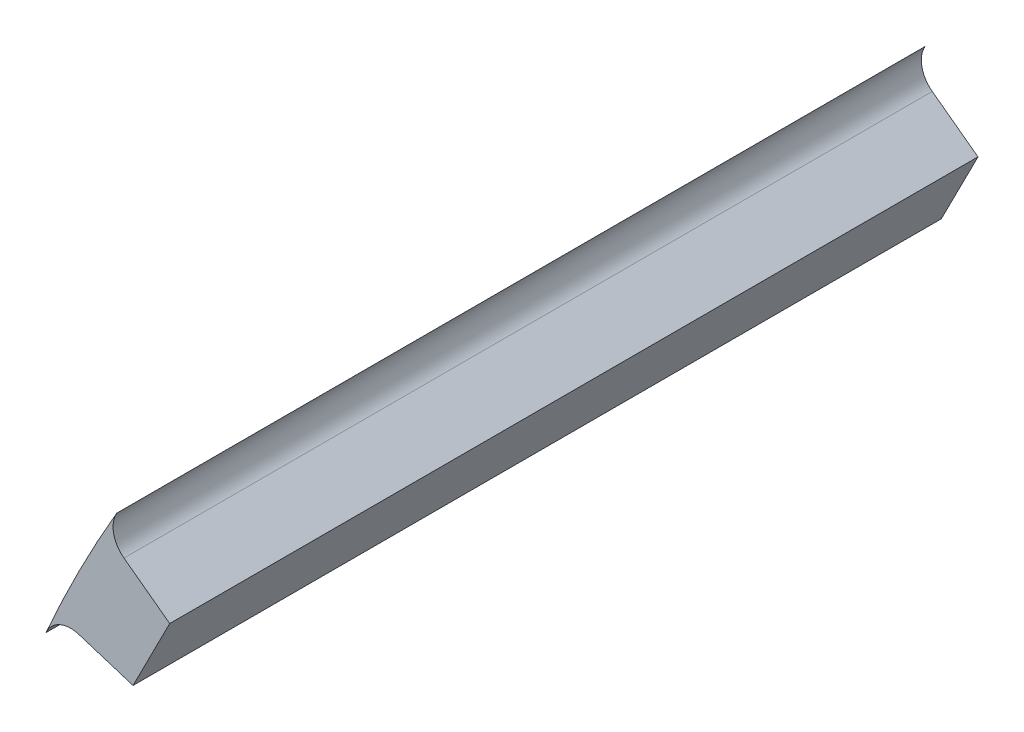
ISO-10303-21;
HEADER;
FILE_DESCRIPTION(('STEP AP214'),'2;1');
FILE_NAME('part.step','',(''),(''),'','','');
FILE_SCHEMA(('AUTOMOTIVE_DESIGN { 1 0 10303 214 1 1 1 1 }'));
ENDSEC;
DATA;
#1=APPLICATION_CONTEXT('core data for automotive mechanical design processes');
#2=APPLICATION_PROTOCOL_DEFINITION('international standard','automotive_design',2000,#1);
#3=PRODUCT_CONTEXT('',#1,'mechanical');
#4=PRODUCT('Part','Part','',(#3));
#5=PRODUCT_RELATED_PRODUCT_CATEGORY('part','',(#4));
#6=PRODUCT_DEFINITION_FORMATION('','',#4);
#7=PRODUCT_DEFINITION_CONTEXT('part definition',#1,'design');
#8=PRODUCT_DEFINITION('design','',#6,#7);
#9=PRODUCT_DEFINITION_SHAPE('','',#8);
#10=(LENGTH_UNIT() NAMED_UNIT(*) SI_UNIT(.MILLI.,.METRE.));
#11=(NAMED_UNIT(*) PLANE_ANGLE_UNIT() SI_UNIT($,.RADIAN.));
#12=(NAMED_UNIT(*) SI_UNIT($,.STERADIAN.) SOLID_ANGLE_UNIT());
#13=UNCERTAINTY_MEASURE_WITH_UNIT(LENGTH_MEASURE(1.E-05),#10,'distance_accuracy_value','');
#14=(GEOMETRIC_REPRESENTATION_CONTEXT(3) GLOBAL_UNCERTAINTY_ASSIGNED_CONTEXT((#13)) GLOBAL_UNIT_ASSIGNED_CONTEXT((#10,
#11,#12)) REPRESENTATION_CONTEXT('',''));
#15=CARTESIAN_POINT('',(0.,0.,0.));
#16=DIRECTION('',(0.,0.,1.));
#17=DIRECTION('',(1.,0.,0.));
#18=AXIS2_PLACEMENT_3D('',#15,#16,#17);
#19=CARTESIAN_POINT('',(1.20451902168447E-10,-5.90258050649772E-11,-4.39891179038199E-11));
#20=DIRECTION('',(0.,0.,-1.));
#21=DIRECTION('',(0.,1.,0.));
#22=AXIS2_PLACEMENT_3D('',#19,#20,#21);
#23=CYLINDRICAL_SURFACE('',#22,50.0000000001273);
#24=CARTESIAN_POINT('',(1.20451981312661E-10,-5.90285877381411E-11,-30.000000000044));
#25=DIRECTION('',(0.,0.,-1.));
#26=DIRECTION('',(0.,1.,0.));
#27=AXIS2_PLACEMENT_3D('',#24,#25,#26);
#28=CIRCLE('',#27,50.0000000001273);
#29=CARTESIAN_POINT('',(-45.7883968132836,20.0853856639251,-30.000000000044));
#30=VERTEX_POINT('',#29);
#31=CARTESIAN_POINT('',(-43.1631627136538,25.2376976872693,-30.000000000044));
#32=VERTEX_POINT('',#31);
#33=EDGE_CURVE('E118',#30,#32,#28,.T.);
#34=ORIENTED_EDGE('',*,*,#33,.F.);
#35=DIRECTION('',(0.,0.,-1.));
#36=VECTOR('',#35,1.);
#37=CARTESIAN_POINT('',(-45.7883968132836,20.0853856639251,-4.39925873507718E-11));
#38=LINE('',#37,#36);
#39=CARTESIAN_POINT('',(-45.7883968132836,20.0853856639251,-4.39925873507718E-11));
#40=VERTEX_POINT('',#39);
#41=EDGE_CURVE('E11',#40,#30,#38,.T.);
#42=ORIENTED_EDGE('',*,*,#41,.F.);
#43=CARTESIAN_POINT('',(1.20451902168447E-10,-5.90258050649772E-11,-4.39891179038199E-11));
#44=DIRECTION('',(0.,0.,-1.));
#45=DIRECTION('',(0.,1.,0.));
#46=AXIS2_PLACEMENT_3D('',#43,#44,#45);
#47=CIRCLE('',#46,50.0000000001273);
#48=CARTESIAN_POINT('',(-43.1631627136538,25.2376976872693,-4.39925873507718E-11));
#49=VERTEX_POINT('',#48);
#50=EDGE_CURVE('E132',#40,#49,#47,.T.);
#51=ORIENTED_EDGE('',*,*,#50,.T.);
#52=DIRECTION('',(0.,0.,-1.));
#53=VECTOR('',#52,1.);
#54=CARTESIAN_POINT('',(-43.1631627136538,25.2376976872693,-4.39925873507718E-11));
#55=LINE('',#54,#53);
#56=EDGE_CURVE('E36',#49,#32,#55,.T.);
#57=ORIENTED_EDGE('',*,*,#56,.T.);
#58=EDGE_LOOP('',(#34,#42,#51,#57));
#59=FACE_BOUND('',#58,.T.);
#60=ADVANCED_FACE('F33',(#59),#23,.T.);
#61=CARTESIAN_POINT('',(-44.8726288770178,19.6836779506466,-4.39925873507718E-11));
#62=DIRECTION('',(0.,0.,-1.));
#63=DIRECTION('',(0.,1.,0.));
#64=AXIS2_PLACEMENT_3D('',#61,#62,#63);
#65=CYLINDRICAL_SURFACE('',#64,1.);
#66=CARTESIAN_POINT('',(-44.8726288770178,19.6836779506466,-30.000000000044));
#67=DIRECTION('',(0.,0.,1.));
#68=DIRECTION('',(0.,1.,0.));
#69=AXIS2_PLACEMENT_3D('',#66,#67,#68);
#70=CIRCLE('',#69,1.);
#71=CARTESIAN_POINT('',(-44.5712959768562,20.6371969506043,-30.000000000044));
#72=VERTEX_POINT('',#71);
#73=EDGE_CURVE('E130',#72,#30,#70,.T.);
#74=ORIENTED_EDGE('',*,*,#73,.F.);
#75=DIRECTION('',(0.,0.,-1.));
#76=VECTOR('',#75,1.);
#77=CARTESIAN_POINT('',(-44.5712959768562,20.6371969506043,-4.39925873507718E-11));
#78=LINE('',#77,#76);
#79=CARTESIAN_POINT('',(-44.5712959768562,20.6371969506043,-4.39925873507718E-11));
#80=VERTEX_POINT('',#79);
#81=EDGE_CURVE('E42',#80,#72,#78,.T.);
#82=ORIENTED_EDGE('',*,*,#81,.F.);
#83=CARTESIAN_POINT('',(-44.8726288770178,19.6836779506466,-4.39925873507718E-11));
#84=DIRECTION('',(0.,0.,1.));
#85=DIRECTION('',(0.,1.,0.));
#86=AXIS2_PLACEMENT_3D('',#83,#84,#85);
#87=CIRCLE('',#86,1.);
#88=EDGE_CURVE('E108',#80,#40,#87,.T.);
#89=ORIENTED_EDGE('',*,*,#88,.T.);
#90=ORIENTED_EDGE('',*,*,#41,.T.);
#91=EDGE_LOOP('',(#74,#82,#89,#90));
#92=FACE_BOUND('',#91,.T.);
#93=ADVANCED_FACE('F140',(#92),#65,.F.);
#94=CARTESIAN_POINT('',(-44.5712959768562,20.6371969506043,-4.39925873507718E-11));
#95=DIRECTION('',(-0.301332900161543,-0.953518999957648,0.));
#96=DIRECTION('',(0.953518999957648,-0.301332900161543,0.));
#97=AXIS2_PLACEMENT_3D('',#94,#95,#96);
#98=PLANE('',#97);
#99=DIRECTION('',(-0.953518999957648,0.301332900161543,0.));
#100=VECTOR('',#99,1.);
#101=CARTESIAN_POINT('',(-44.5712959768562,20.6371969506043,-30.000000000044));
#102=LINE('',#101,#100);
#103=CARTESIAN_POINT('',(-42.5582923864564,20.0010437014737,-30.000000000044));
#104=VERTEX_POINT('',#103);
#105=EDGE_CURVE('E95',#104,#72,#102,.T.);
#106=ORIENTED_EDGE('',*,*,#105,.F.);
#107=DIRECTION('',(0.,0.,-1.));
#108=VECTOR('',#107,1.);
#109=CARTESIAN_POINT('',(-42.5582923864564,20.0010437014737,-4.39925873507718E-11));
#110=LINE('',#109,#108);
#111=CARTESIAN_POINT('',(-42.5582923864564,20.0010437014737,-4.39925873507718E-11));
#112=VERTEX_POINT('',#111);
#113=EDGE_CURVE('E90',#112,#104,#110,.T.);
#114=ORIENTED_EDGE('',*,*,#113,.F.);
#115=DIRECTION('',(-0.953518999957648,0.301332900161543,0.));
#116=VECTOR('',#115,1.);
#117=CARTESIAN_POINT('',(-44.5712959768562,20.6371969506043,-4.39925873507718E-11));
#118=LINE('',#117,#116);
#119=EDGE_CURVE('E93',#112,#80,#118,.T.);
#120=ORIENTED_EDGE('',*,*,#119,.T.);
#121=ORIENTED_EDGE('',*,*,#81,.T.);
#122=EDGE_LOOP('',(#106,#114,#120,#121));
#123=FACE_BOUND('',#122,.T.);
#124=ADVANCED_FACE('F92',(#123),#98,.T.);
#125=CARTESIAN_POINT('',(-42.5582923864564,20.0010437014737,-4.39925873507718E-11));
#126=DIRECTION('',(0.891006524188383,-0.453990499739518,0.));
#127=DIRECTION('',(0.453990499739518,0.891006524188383,0.));
#128=AXIS2_PLACEMENT_3D('',#125,#126,#127);
#129=PLANE('',#128);
#130=DIRECTION('',(-0.453990499739518,-0.891006524188383,0.));
#131=VECTOR('',#130,1.);
#132=CARTESIAN_POINT('',(-42.5582923864564,20.0010437014737,-30.000000000044));
#133=LINE('',#132,#131);
#134=CARTESIAN_POINT('',(-41.1963208872378,22.6740632740388,-30.000000000044));
#135=VERTEX_POINT('',#134);
#136=EDGE_CURVE('E127',#135,#104,#133,.T.);
#137=ORIENTED_EDGE('',*,*,#136,.F.);
#138=DIRECTION('',(0.,0.,-1.));
#139=VECTOR('',#138,1.);
#140=CARTESIAN_POINT('',(-41.1963208872378,22.6740632740388,-4.39925873507718E-11));
#141=LINE('',#140,#139);
#142=CARTESIAN_POINT('',(-41.1963208872378,22.6740632740388,-4.39925873507718E-11));
#143=VERTEX_POINT('',#142);
#144=EDGE_CURVE('E100',#143,#135,#141,.T.);
#145=ORIENTED_EDGE('',*,*,#144,.F.);
#146=DIRECTION('',(-0.453990499739518,-0.891006524188383,0.));
#147=VECTOR('',#146,1.);
#148=CARTESIAN_POINT('',(-42.5582923864564,20.0010437014737,-4.39925873507718E-11));
#149=LINE('',#148,#147);
#150=EDGE_CURVE('E106',#143,#112,#149,.T.);
#151=ORIENTED_EDGE('',*,*,#150,.T.);
#152=ORIENTED_EDGE('',*,*,#113,.T.);
#153=EDGE_LOOP('',(#137,#145,#151,#152));
#154=FACE_BOUND('',#153,.T.);
#155=ADVANCED_FACE('F110',(#154),#129,.T.);
#156=CARTESIAN_POINT('',(-41.1963208872378,22.6740632740388,-4.39925873507718E-11));
#157=DIRECTION('',(0.59429404067962,0.804247843150785,0.));
#158=DIRECTION('',(-0.804247843150785,0.59429404067962,0.));
#159=AXIS2_PLACEMENT_3D('',#156,#157,#158);
#160=PLANE('',#159);
#161=DIRECTION('',(0.804247843150785,-0.59429404067962,0.));
#162=VECTOR('',#161,1.);
#163=CARTESIAN_POINT('',(-41.1963208872378,22.6740632740388,-30.000000000044));
#164=LINE('',#163,#162);
#165=CARTESIAN_POINT('',(-42.8941935000602,23.9286958903731,-30.000000000044));
#166=VERTEX_POINT('',#165);
#167=EDGE_CURVE('E124',#166,#135,#164,.T.);
#168=ORIENTED_EDGE('',*,*,#167,.F.);
#169=DIRECTION('',(0.,0.,-1.));
#170=VECTOR('',#169,1.);
#171=CARTESIAN_POINT('',(-42.8941935000602,23.9286958903731,-4.39925873507718E-11));
#172=LINE('',#171,#170);
#173=CARTESIAN_POINT('',(-42.8941935000602,23.9286958903731,-4.39925873507718E-11));
#174=VERTEX_POINT('',#173);
#175=EDGE_CURVE('E135',#174,#166,#172,.T.);
#176=ORIENTED_EDGE('',*,*,#175,.F.);
#177=DIRECTION('',(0.804247843150785,-0.59429404067962,0.));
#178=VECTOR('',#177,1.);
#179=CARTESIAN_POINT('',(-41.1963208872378,22.6740632740388,-4.39925873507718E-11));
#180=LINE('',#179,#178);
#181=EDGE_CURVE('E111',#174,#143,#180,.T.);
#182=ORIENTED_EDGE('',*,*,#181,.T.);
#183=ORIENTED_EDGE('',*,*,#144,.T.);
#184=EDGE_LOOP('',(#168,#176,#182,#183));
#185=FACE_BOUND('',#184,.T.);
#186=ADVANCED_FACE('F153',(#185),#160,.T.);
#187=CARTESIAN_POINT('',(-42.2998994593806,24.7329437335239,-4.39925873507718E-11));
#188=DIRECTION('',(0.,0.,-1.));
#189=DIRECTION('',(0.,1.,0.));
#190=AXIS2_PLACEMENT_3D('',#187,#188,#189);
#191=CYLINDRICAL_SURFACE('',#190,1.);
#192=CARTESIAN_POINT('',(-42.2998994593806,24.7329437335239,-30.000000000044));
#193=DIRECTION('',(0.,0.,1.));
#194=DIRECTION('',(0.,1.,0.));
#195=AXIS2_PLACEMENT_3D('',#192,#193,#194);
#196=CIRCLE('',#195,1.);
#197=EDGE_CURVE('E121',#32,#166,#196,.T.);
#198=ORIENTED_EDGE('',*,*,#197,.F.);
#199=ORIENTED_EDGE('',*,*,#56,.F.);
#200=CARTESIAN_POINT('',(-42.2998994593806,24.7329437335239,-4.39925873507718E-11));
#201=DIRECTION('',(0.,0.,1.));
#202=DIRECTION('',(0.,1.,0.));
#203=AXIS2_PLACEMENT_3D('',#200,#201,#202);
#204=CIRCLE('',#203,1.);
#205=EDGE_CURVE('E113',#49,#174,#204,.T.);
#206=ORIENTED_EDGE('',*,*,#205,.T.);
#207=ORIENTED_EDGE('',*,*,#175,.T.);
#208=EDGE_LOOP('',(#198,#199,#206,#207));
#209=FACE_BOUND('',#208,.T.);
#210=ADVANCED_FACE('F137',(#209),#191,.F.);
#211=CARTESIAN_POINT('',(1.20451902168447E-10,-5.90258050649772E-11,-4.39891179038199E-11));
#212=DIRECTION('',(0.,0.,-1.));
#213=DIRECTION('',(0.,1.,0.));
#214=AXIS2_PLACEMENT_3D('',#211,#212,#213);
#215=PLANE('',#214);
#216=ORIENTED_EDGE('',*,*,#50,.F.);
#217=ORIENTED_EDGE('',*,*,#88,.F.);
#218=ORIENTED_EDGE('',*,*,#119,.F.);
#219=ORIENTED_EDGE('',*,*,#150,.F.);
#220=ORIENTED_EDGE('',*,*,#181,.F.);
#221=ORIENTED_EDGE('',*,*,#205,.F.);
#222=EDGE_LOOP('',(#216,#217,#218,#219,#220,#221));
#223=FACE_BOUND('',#222,.T.);
#224=ADVANCED_FACE('F104',(#223),#215,.F.);
#225=CARTESIAN_POINT('',(1.20451981312661E-10,-5.90285877381411E-11,-30.000000000044));
#226=DIRECTION('',(0.,0.,-1.));
#227=DIRECTION('',(0.,1.,0.));
#228=AXIS2_PLACEMENT_3D('',#225,#226,#227);
#229=PLANE('',#228);
#230=ORIENTED_EDGE('',*,*,#33,.T.);
#231=ORIENTED_EDGE('',*,*,#197,.T.);
#232=ORIENTED_EDGE('',*,*,#167,.T.);
#233=ORIENTED_EDGE('',*,*,#136,.T.);
#234=ORIENTED_EDGE('',*,*,#105,.T.);
#235=ORIENTED_EDGE('',*,*,#73,.T.);
#236=EDGE_LOOP('',(#230,#231,#232,#233,#234,#235));
#237=FACE_BOUND('',#236,.T.);
#238=ADVANCED_FACE('F139',(#237),#229,.T.);
#239=CLOSED_SHELL('',(#60,#93,#124,#155,#186,#210,#224,#238));
#240=MANIFOLD_SOLID_BREP('B2',#239);
#241=ADVANCED_BREP_SHAPE_REPRESENTATION('',(#18,#240),#14);
#242=SHAPE_DEFINITION_REPRESENTATION(#9,#241);
ENDSEC;
END-ISO-10303-21;
